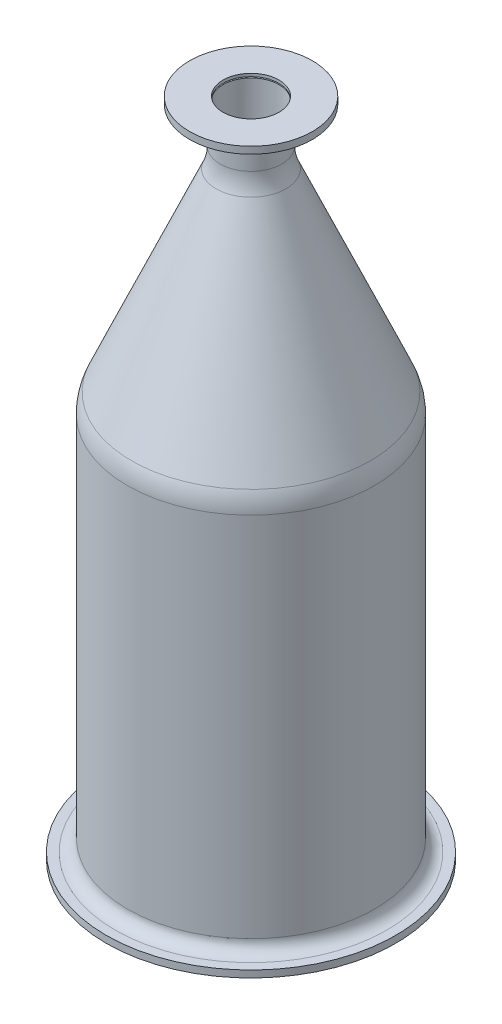
ISO-10303-21;
HEADER;
FILE_DESCRIPTION(('STEP AP214'),'2;1');
FILE_NAME('part.step','',(''),(''),'','','');
FILE_SCHEMA(('AUTOMOTIVE_DESIGN { 1 0 10303 214 1 1 1 1 }'));
ENDSEC;
DATA;
#1=APPLICATION_CONTEXT('core data for automotive mechanical design processes');
#2=APPLICATION_PROTOCOL_DEFINITION('international standard','automotive_design',2000,#1);
#3=PRODUCT_CONTEXT('',#1,'mechanical');
#4=PRODUCT('Part','Part','',(#3));
#5=PRODUCT_RELATED_PRODUCT_CATEGORY('part','',(#4));
#6=PRODUCT_DEFINITION_FORMATION('','',#4);
#7=PRODUCT_DEFINITION_CONTEXT('part definition',#1,'design');
#8=PRODUCT_DEFINITION('design','',#6,#7);
#9=PRODUCT_DEFINITION_SHAPE('','',#8);
#10=(LENGTH_UNIT() NAMED_UNIT(*) SI_UNIT(.MILLI.,.METRE.));
#11=(NAMED_UNIT(*) PLANE_ANGLE_UNIT() SI_UNIT($,.RADIAN.));
#12=(NAMED_UNIT(*) SI_UNIT($,.STERADIAN.) SOLID_ANGLE_UNIT());
#13=UNCERTAINTY_MEASURE_WITH_UNIT(LENGTH_MEASURE(1.E-05),#10,'distance_accuracy_value','');
#14=(GEOMETRIC_REPRESENTATION_CONTEXT(3) GLOBAL_UNCERTAINTY_ASSIGNED_CONTEXT((#13)) GLOBAL_UNIT_ASSIGNED_CONTEXT((#10,
#11,#12)) REPRESENTATION_CONTEXT('',''));
#15=CARTESIAN_POINT('',(0.,0.,0.));
#16=DIRECTION('',(0.,0.,1.));
#17=DIRECTION('',(1.,0.,0.));
#18=AXIS2_PLACEMENT_3D('',#15,#16,#17);
#19=CARTESIAN_POINT('',(0.,272.,0.));
#20=DIRECTION('',(0.,-1.,0.));
#21=DIRECTION('',(0.,0.,-1.));
#22=AXIS2_PLACEMENT_3D('',#19,#20,#21);
#23=CYLINDRICAL_SURFACE('',#22,12.7);
#24=CARTESIAN_POINT('',(0.,264.15,0.));
#25=DIRECTION('',(0.,1.,0.));
#26=DIRECTION('',(0.,0.,1.));
#27=AXIS2_PLACEMENT_3D('',#24,#25,#26);
#28=CIRCLE('',#27,12.7);
#29=CARTESIAN_POINT('',(0.,264.15,12.7));
#30=VERTEX_POINT('',#29);
#31=EDGE_CURVE('E11',#30,#30,#28,.F.);
#32=ORIENTED_EDGE('',*,*,#31,.T.);
#33=EDGE_LOOP('',(#32));
#34=FACE_BOUND('',#33,.T.);
#35=CARTESIAN_POINT('',(0.,254.180741628907,0.));
#36=DIRECTION('',(0.,1.,0.));
#37=DIRECTION('',(0.,0.,1.));
#38=AXIS2_PLACEMENT_3D('',#35,#36,#37);
#39=CIRCLE('',#38,12.7);
#40=CARTESIAN_POINT('',(0.,254.180741628907,12.7));
#41=VERTEX_POINT('',#40);
#42=EDGE_CURVE('E62',#41,#41,#39,.T.);
#43=ORIENTED_EDGE('',*,*,#42,.T.);
#44=EDGE_LOOP('',(#43));
#45=FACE_BOUND('',#44,.T.);
#46=ADVANCED_FACE('F33',(#34,#45),#23,.T.);
#47=CARTESIAN_POINT('',(0.,2.85,0.));
#48=DIRECTION('',(0.,-1.,0.));
#49=DIRECTION('',(0.,0.,-1.));
#50=AXIS2_PLACEMENT_3D('',#47,#48,#49);
#51=CYLINDRICAL_SURFACE('',#50,59.5);
#52=CARTESIAN_POINT('',(0.,2.85,0.));
#53=DIRECTION('',(0.,1.,0.));
#54=DIRECTION('',(0.,0.,1.));
#55=AXIS2_PLACEMENT_3D('',#52,#53,#54);
#56=CIRCLE('',#55,59.5);
#57=CARTESIAN_POINT('',(0.,2.85,59.5));
#58=VERTEX_POINT('',#57);
#59=EDGE_CURVE('E74',#58,#58,#56,.T.);
#60=ORIENTED_EDGE('',*,*,#59,.F.);
#61=EDGE_LOOP('',(#60));
#62=FACE_BOUND('',#61,.T.);
#63=CARTESIAN_POINT('',(0.,0.,0.));
#64=DIRECTION('',(0.,1.,0.));
#65=DIRECTION('',(0.,0.,1.));
#66=AXIS2_PLACEMENT_3D('',#63,#64,#65);
#67=CIRCLE('',#66,59.5);
#68=CARTESIAN_POINT('',(0.,0.,59.5));
#69=VERTEX_POINT('',#68);
#70=EDGE_CURVE('E80',#69,#69,#67,.T.);
#71=ORIENTED_EDGE('',*,*,#70,.T.);
#72=EDGE_LOOP('',(#71));
#73=FACE_BOUND('',#72,.T.);
#74=ADVANCED_FACE('F148',(#62,#73),#51,.T.);
#75=CARTESIAN_POINT('',(0.,2.85,0.));
#76=DIRECTION('',(0.,1.,0.));
#77=DIRECTION('',(0.,0.,1.));
#78=AXIS2_PLACEMENT_3D('',#75,#76,#77);
#79=PLANE('',#78);
#80=CARTESIAN_POINT('',(0.,2.85,0.));
#81=DIRECTION('',(0.,1.,0.));
#82=DIRECTION('',(0.,0.,1.));
#83=AXIS2_PLACEMENT_3D('',#80,#81,#82);
#84=CIRCLE('',#83,55.8);
#85=CARTESIAN_POINT('',(0.,2.85,55.8));
#86=VERTEX_POINT('',#85);
#87=EDGE_CURVE('E44',#86,#86,#84,.F.);
#88=ORIENTED_EDGE('',*,*,#87,.T.);
#89=EDGE_LOOP('',(#88));
#90=FACE_BOUND('',#89,.T.);
#91=ORIENTED_EDGE('',*,*,#59,.T.);
#92=EDGE_LOOP('',(#91));
#93=FACE_BOUND('',#92,.T.);
#94=ADVANCED_FACE('F153',(#90,#93),#79,.T.);
#95=CARTESIAN_POINT('',(0.,0.,0.));
#96=DIRECTION('',(0.,1.,0.));
#97=DIRECTION('',(0.,0.,1.));
#98=AXIS2_PLACEMENT_3D('',#95,#96,#97);
#99=PLANE('',#98);
#100=CARTESIAN_POINT('',(0.,0.,0.));
#101=DIRECTION('',(0.,-1.,0.));
#102=DIRECTION('',(0.,0.,-1.));
#103=AXIS2_PLACEMENT_3D('',#100,#101,#102);
#104=CIRCLE('',#103,48.8);
#105=CARTESIAN_POINT('',(0.,0.,-48.8));
#106=VERTEX_POINT('',#105);
#107=EDGE_CURVE('E89',#106,#106,#104,.T.);
#108=ORIENTED_EDGE('',*,*,#107,.F.);
#109=EDGE_LOOP('',(#108));
#110=FACE_BOUND('',#109,.T.);
#111=ORIENTED_EDGE('',*,*,#70,.F.);
#112=EDGE_LOOP('',(#111));
#113=FACE_BOUND('',#112,.T.);
#114=ADVANCED_FACE('F160',(#110,#113),#99,.F.);
#115=CARTESIAN_POINT('',(0.,162.85,0.));
#116=DIRECTION('',(0.,-1.,0.));
#117=DIRECTION('',(0.,0.,-1.));
#118=AXIS2_PLACEMENT_3D('',#115,#116,#117);
#119=CYLINDRICAL_SURFACE('',#118,50.8);
#120=CARTESIAN_POINT('',(0.,7.85,0.));
#121=DIRECTION('',(0.,1.,0.));
#122=DIRECTION('',(0.,0.,1.));
#123=AXIS2_PLACEMENT_3D('',#120,#121,#122);
#124=CIRCLE('',#123,50.8);
#125=CARTESIAN_POINT('',(0.,7.85,50.8));
#126=VERTEX_POINT('',#125);
#127=EDGE_CURVE('E48',#126,#126,#124,.T.);
#128=ORIENTED_EDGE('',*,*,#127,.T.);
#129=EDGE_LOOP('',(#128));
#130=FACE_BOUND('',#129,.T.);
#131=CARTESIAN_POINT('',(0.,158.669258371093,0.));
#132=DIRECTION('',(0.,-1.,0.));
#133=DIRECTION('',(0.,0.,-1.));
#134=AXIS2_PLACEMENT_3D('',#131,#132,#133);
#135=CIRCLE('',#134,50.8);
#136=CARTESIAN_POINT('',(0.,158.669258371093,-50.8));
#137=VERTEX_POINT('',#136);
#138=EDGE_CURVE('E53',#137,#137,#135,.T.);
#139=ORIENTED_EDGE('',*,*,#138,.T.);
#140=EDGE_LOOP('',(#139));
#141=FACE_BOUND('',#140,.T.);
#142=ADVANCED_FACE('F144',(#130,#141),#119,.T.);
#143=CARTESIAN_POINT('',(0.,250.,0.));
#144=DIRECTION('',(0.,-1.,0.));
#145=DIRECTION('',(0.,0.,-1.));
#146=AXIS2_PLACEMENT_3D('',#143,#144,#145);
#147=CONICAL_SURFACE('',#146,12.7,0.412139536781909);
#148=CARTESIAN_POINT('',(0.,246.169329071286,0.));
#149=DIRECTION('',(0.,1.,0.));
#150=DIRECTION('',(0.,0.,1.));
#151=AXIS2_PLACEMENT_3D('',#148,#149,#150);
#152=CIRCLE('',#151,14.3746822992999);
#153=CARTESIAN_POINT('',(0.,246.169329071286,-14.3746822992999));
#154=VERTEX_POINT('',#153);
#155=EDGE_CURVE('E56',#154,#154,#152,.F.);
#156=CARTESIAN_POINT('',(0.,166.680670928714,0.));
#157=DIRECTION('',(0.,-1.,0.));
#158=DIRECTION('',(0.,0.,-1.));
#159=AXIS2_PLACEMENT_3D('',#156,#157,#158);
#160=CIRCLE('',#159,49.1253177007001);
#161=CARTESIAN_POINT('',(0.,166.680670928714,-49.1253177007001));
#162=VERTEX_POINT('',#161);
#163=EDGE_CURVE('E59',#162,#162,#160,.F.);
#164=CARTESIAN_POINT('',(0.,246.169329071286,-14.3746822992999));
#165=CARTESIAN_POINT('',(0.,245.341322215635,-14.7366680847312));
#166=CARTESIAN_POINT('',(0.,244.513315359983,-15.0986538701624));
#167=CARTESIAN_POINT('',(0.,242.857301648679,-15.8226254410249));
#168=CARTESIAN_POINT('',(0.,242.029294793027,-16.1846112264562));
#169=CARTESIAN_POINT('',(0.,240.373281081724,-16.9085827973187));
#170=CARTESIAN_POINT('',(0.,239.545274226072,-17.2705685827499));
#171=CARTESIAN_POINT('',(0.,237.889260514768,-17.9945401536124));
#172=CARTESIAN_POINT('',(0.,237.061253659117,-18.3565259390437));
#173=CARTESIAN_POINT('',(0.,235.405239947813,-19.0804975099062));
#174=CARTESIAN_POINT('',(0.,234.577233092161,-19.4424832953374));
#175=CARTESIAN_POINT('',(0.,232.921219380858,-20.1664548661999));
#176=CARTESIAN_POINT('',(0.,232.093212525206,-20.5284406516312));
#177=CARTESIAN_POINT('',(0.,230.437198813902,-21.2524122224937));
#178=CARTESIAN_POINT('',(0.,229.60919195825,-21.6143980079249));
#179=CARTESIAN_POINT('',(0.,227.953178246947,-22.3383695787875));
#180=CARTESIAN_POINT('',(0.,227.125171391295,-22.7003553642187));
#181=CARTESIAN_POINT('',(0.,225.469157679991,-23.4243269350812));
#182=CARTESIAN_POINT('',(0.,224.64115082434,-23.7863127205125));
#183=CARTESIAN_POINT('',(0.,222.985137113036,-24.510284291375));
#184=CARTESIAN_POINT('',(0.,222.157130257384,-24.8722700768062));
#185=CARTESIAN_POINT('',(0.,220.501116546081,-25.5962416476687));
#186=CARTESIAN_POINT('',(0.,219.673109690429,-25.9582274331));
#187=CARTESIAN_POINT('',(0.,218.017095979125,-26.6821990039625));
#188=CARTESIAN_POINT('',(0.,217.189089123473,-27.0441847893937));
#189=CARTESIAN_POINT('',(0.,215.53307541217,-27.7681563602562));
#190=CARTESIAN_POINT('',(0.,214.705068556518,-28.1301421456875));
#191=CARTESIAN_POINT('',(0.,213.049054845214,-28.85411371655));
#192=CARTESIAN_POINT('',(0.,212.221047989563,-29.2160995019812));
#193=CARTESIAN_POINT('',(0.,210.565034278259,-29.9400710728437));
#194=CARTESIAN_POINT('',(0.,209.737027422607,-30.302056858275));
#195=CARTESIAN_POINT('',(0.,208.081013711304,-31.0260284291375));
#196=CARTESIAN_POINT('',(0.,207.253006855652,-31.3880142145688));
#197=CARTESIAN_POINT('',(0.,205.596993144348,-32.1119857854313));
#198=CARTESIAN_POINT('',(0.,204.768986288696,-32.4739715708625));
#199=CARTESIAN_POINT('',(0.,203.112972577393,-33.197943141725));
#200=CARTESIAN_POINT('',(0.,202.284965721741,-33.5599289271563));
#201=CARTESIAN_POINT('',(0.,200.628952010437,-34.2839004980188));
#202=CARTESIAN_POINT('',(0.,199.800945154786,-34.64588628345));
#203=CARTESIAN_POINT('',(0.,198.144931443482,-35.3698578543125));
#204=CARTESIAN_POINT('',(0.,197.31692458783,-35.7318436397438));
#205=CARTESIAN_POINT('',(0.,195.660910876527,-36.4558152106063));
#206=CARTESIAN_POINT('',(0.,194.832904020875,-36.8178009960375));
#207=CARTESIAN_POINT('',(0.,193.176890309571,-37.5417725669));
#208=CARTESIAN_POINT('',(0.,192.348883453919,-37.9037583523313));
#209=CARTESIAN_POINT('',(0.,190.692869742616,-38.6277299231938));
#210=CARTESIAN_POINT('',(0.,189.864862886964,-38.989715708625));
#211=CARTESIAN_POINT('',(0.,188.20884917566,-39.7136872794875));
#212=CARTESIAN_POINT('',(0.,187.380842320009,-40.0756730649188));
#213=CARTESIAN_POINT('',(0.,185.724828608705,-40.7996446357813));
#214=CARTESIAN_POINT('',(0.,184.896821753053,-41.1616304212125));
#215=CARTESIAN_POINT('',(0.,183.24080804175,-41.885601992075));
#216=CARTESIAN_POINT('',(0.,182.412801186098,-42.2475877775063));
#217=CARTESIAN_POINT('',(0.,180.756787474794,-42.9715593483688));
#218=CARTESIAN_POINT('',(0.,179.928780619142,-43.3335451338001));
#219=CARTESIAN_POINT('',(0.,178.272766907839,-44.0575167046626));
#220=CARTESIAN_POINT('',(0.,177.444760052187,-44.4195024900938));
#221=CARTESIAN_POINT('',(0.,175.788746340883,-45.1434740609563));
#222=CARTESIAN_POINT('',(0.,174.960739485232,-45.5054598463876));
#223=CARTESIAN_POINT('',(0.,173.304725773928,-46.2294314172501));
#224=CARTESIAN_POINT('',(0.,172.476718918276,-46.5914172026813));
#225=CARTESIAN_POINT('',(0.,170.820705206973,-47.3153887735438));
#226=CARTESIAN_POINT('',(0.,169.992698351321,-47.6773745589751));
#227=CARTESIAN_POINT('',(0.,168.336684640017,-48.4013461298376));
#228=CARTESIAN_POINT('',(0.,167.508677784365,-48.7633319152689));
#229=CARTESIAN_POINT('',(0.,166.680670928714,-49.1253177007001));
#230=B_SPLINE_CURVE_WITH_KNOTS('',3,(#164,#165,#166,#167,#168,#169,#170,#171,#172,#173,#174,
#175,#176,#177,#178,#179,#180,#181,#182,#183,#184,#185,#186,#187,#188,#189,#190,#191,#192,#193,
#194,#195,#196,#197,#198,#199,#200,#201,#202,#203,#204,#205,#206,#207,#208,#209,#210,#211,#212,
#213,#214,#215,#216,#217,#218,#219,#220,#221,#222,#223,#224,#225,#226,#227,#228,#229),
.UNSPECIFIED.,.F.,.F.,(4,2,2,2,2,2,2,2,2,2,2,2,2,2,2,2,2,2,2,2,2,2,2,2,2,2,2,2,2,2,2,2,4),(0.,
2.71102592328918,5.42205184657837,8.13307776986752,10.8441036931567,13.5551296164459,
16.2661555397351,18.9771814630243,21.6882073863134,24.3992333096026,27.1102592328918,
29.821285156181,32.5323110794702,35.2433370027593,37.9543629260485,40.6653888493377,
43.3764147726269,46.0874406959161,48.7984666192052,51.5094925424944,54.2205184657836,
56.9315443890728,59.642570312362,62.3535962356511,65.0646221589403,67.7756480822295,
70.4866740055187,73.1976999288079,75.9087258520971,78.6197517753863,81.3307776986754,
84.0418036219646,86.7528295452538),.UNSPECIFIED.);
#231=EDGE_CURVE('BSEAM136',#154,#162,#230,.T.);
#232=ORIENTED_EDGE('',*,*,#155,.T.);
#233=ORIENTED_EDGE('',*,*,#163,.T.);
#234=ORIENTED_EDGE('',*,*,#231,.T.);
#235=ORIENTED_EDGE('',*,*,#231,.F.);
#236=EDGE_LOOP('',(#232,#234,#233,#235));
#237=FACE_BOUND('',#236,.T.);
#238=ADVANCED_FACE('F136',(#237),#147,.T.);
#239=CARTESIAN_POINT('',(0.,269.15,0.));
#240=DIRECTION('',(0.,1.,0.));
#241=DIRECTION('',(0.,0.,1.));
#242=AXIS2_PLACEMENT_3D('',#239,#240,#241);
#243=CYLINDRICAL_SURFACE('',#242,25.25);
#244=CARTESIAN_POINT('',(0.,269.15,0.));
#245=DIRECTION('',(0.,1.,0.));
#246=DIRECTION('',(0.,0.,1.));
#247=AXIS2_PLACEMENT_3D('',#244,#245,#246);
#248=CIRCLE('',#247,25.25);
#249=CARTESIAN_POINT('',(0.,269.15,25.25));
#250=VERTEX_POINT('',#249);
#251=EDGE_CURVE('E83',#250,#250,#248,.T.);
#252=ORIENTED_EDGE('',*,*,#251,.T.);
#253=EDGE_LOOP('',(#252));
#254=FACE_BOUND('',#253,.T.);
#255=CARTESIAN_POINT('',(0.,272.,0.));
#256=DIRECTION('',(0.,1.,0.));
#257=DIRECTION('',(0.,0.,1.));
#258=AXIS2_PLACEMENT_3D('',#255,#256,#257);
#259=CIRCLE('',#258,25.25);
#260=CARTESIAN_POINT('',(0.,272.,25.25));
#261=VERTEX_POINT('',#260);
#262=EDGE_CURVE('E86',#261,#261,#259,.T.);
#263=ORIENTED_EDGE('',*,*,#262,.F.);
#264=EDGE_LOOP('',(#263));
#265=FACE_BOUND('',#264,.T.);
#266=ADVANCED_FACE('F134',(#254,#265),#243,.T.);
#267=CARTESIAN_POINT('',(0.,269.15,0.));
#268=DIRECTION('',(0.,1.,0.));
#269=DIRECTION('',(0.,0.,1.));
#270=AXIS2_PLACEMENT_3D('',#267,#268,#269);
#271=PLANE('',#270);
#272=CARTESIAN_POINT('',(0.,269.15,0.));
#273=DIRECTION('',(0.,1.,0.));
#274=DIRECTION('',(0.,0.,1.));
#275=AXIS2_PLACEMENT_3D('',#272,#273,#274);
#276=CIRCLE('',#275,17.7);
#277=CARTESIAN_POINT('',(0.,269.15,17.7));
#278=VERTEX_POINT('',#277);
#279=EDGE_CURVE('E40',#278,#278,#276,.T.);
#280=ORIENTED_EDGE('',*,*,#279,.T.);
#281=EDGE_LOOP('',(#280));
#282=FACE_BOUND('',#281,.T.);
#283=ORIENTED_EDGE('',*,*,#251,.F.);
#284=EDGE_LOOP('',(#283));
#285=FACE_BOUND('',#284,.T.);
#286=ADVANCED_FACE('F130',(#282,#285),#271,.F.);
#287=CARTESIAN_POINT('',(0.,272.,0.));
#288=DIRECTION('',(0.,1.,0.));
#289=DIRECTION('',(0.,0.,1.));
#290=AXIS2_PLACEMENT_3D('',#287,#288,#289);
#291=PLANE('',#290);
#292=CARTESIAN_POINT('',(0.,272.,0.));
#293=DIRECTION('',(0.,1.,0.));
#294=DIRECTION('',(0.,0.,1.));
#295=AXIS2_PLACEMENT_3D('',#292,#293,#294);
#296=CIRCLE('',#295,11.5);
#297=CARTESIAN_POINT('',(0.,272.,11.5));
#298=VERTEX_POINT('',#297);
#299=EDGE_CURVE('E79',#298,#298,#296,.T.);
#300=ORIENTED_EDGE('',*,*,#299,.F.);
#301=EDGE_LOOP('',(#300));
#302=FACE_BOUND('',#301,.T.);
#303=ORIENTED_EDGE('',*,*,#262,.T.);
#304=EDGE_LOOP('',(#303));
#305=FACE_BOUND('',#304,.T.);
#306=ADVANCED_FACE('F126',(#302,#305),#291,.T.);
#307=CARTESIAN_POINT('',(0.,162.85,0.));
#308=DIRECTION('',(0.,-1.,0.));
#309=DIRECTION('',(0.,0.,-1.));
#310=AXIS2_PLACEMENT_3D('',#307,#308,#309);
#311=CYLINDRICAL_SURFACE('',#310,48.8);
#312=CARTESIAN_POINT('',(0.,156.026511156307,0.));
#313=DIRECTION('',(0.,1.,0.));
#314=DIRECTION('',(0.,0.,1.));
#315=AXIS2_PLACEMENT_3D('',#312,#313,#314);
#316=CIRCLE('',#315,48.8);
#317=CARTESIAN_POINT('',(0.,156.026511156307,48.8));
#318=VERTEX_POINT('',#317);
#319=EDGE_CURVE('E71',#318,#318,#316,.T.);
#320=ORIENTED_EDGE('',*,*,#319,.T.);
#321=EDGE_LOOP('',(#320));
#322=FACE_BOUND('',#321,.T.);
#323=ORIENTED_EDGE('',*,*,#107,.T.);
#324=EDGE_LOOP('',(#323));
#325=FACE_BOUND('',#324,.T.);
#326=ADVANCED_FACE('F129',(#322,#325),#311,.F.);
#327=CARTESIAN_POINT('',(0.,272.,0.));
#328=DIRECTION('',(0.,-1.,0.));
#329=DIRECTION('',(0.,0.,-1.));
#330=AXIS2_PLACEMENT_3D('',#327,#328,#329);
#331=CYLINDRICAL_SURFACE('',#330,11.5);
#332=CARTESIAN_POINT('',(0.,253.929897131173,0.));
#333=DIRECTION('',(0.,-1.,0.));
#334=DIRECTION('',(0.,0.,-1.));
#335=AXIS2_PLACEMENT_3D('',#332,#333,#334);
#336=CIRCLE('',#335,11.5);
#337=CARTESIAN_POINT('',(0.,253.929897131173,-11.5));
#338=VERTEX_POINT('',#337);
#339=EDGE_CURVE('E65',#338,#338,#336,.T.);
#340=ORIENTED_EDGE('',*,*,#339,.T.);
#341=EDGE_LOOP('',(#340));
#342=FACE_BOUND('',#341,.T.);
#343=CARTESIAN_POINT('',(0.,270.35,0.));
#344=DIRECTION('',(0.,1.,0.));
#345=DIRECTION('',(0.,0.,1.));
#346=AXIS2_PLACEMENT_3D('',#343,#344,#345);
#347=CIRCLE('',#346,11.5);
#348=CARTESIAN_POINT('',(0.,270.35,11.5));
#349=VERTEX_POINT('',#348);
#350=EDGE_CURVE('E94',#349,#349,#347,.T.);
#351=ORIENTED_EDGE('',*,*,#350,.T.);
#352=EDGE_LOOP('',(#351));
#353=FACE_BOUND('',#352,.T.);
#354=ADVANCED_FACE('F285',(#342,#353),#331,.F.);
#355=CARTESIAN_POINT('',(0.,2.85,0.));
#356=DIRECTION('',(0.,-1.,0.));
#357=DIRECTION('',(0.,0.,-1.));
#358=AXIS2_PLACEMENT_3D('',#355,#356,#357);
#359=CYLINDRICAL_SURFACE('',#358,58.3);
#360=CARTESIAN_POINT('',(0.,1.65,0.));
#361=DIRECTION('',(0.,1.,0.));
#362=DIRECTION('',(0.,0.,1.));
#363=AXIS2_PLACEMENT_3D('',#360,#361,#362);
#364=CIRCLE('',#363,58.3);
#365=CARTESIAN_POINT('',(0.,1.65,58.3));
#366=VERTEX_POINT('',#365);
#367=EDGE_CURVE('E110',#366,#366,#364,.T.);
#368=ORIENTED_EDGE('',*,*,#367,.T.);
#369=EDGE_LOOP('',(#368));
#370=FACE_BOUND('',#369,.T.);
#371=CARTESIAN_POINT('',(0.,1.2,0.));
#372=DIRECTION('',(0.,1.,0.));
#373=DIRECTION('',(0.,0.,1.));
#374=AXIS2_PLACEMENT_3D('',#371,#372,#373);
#375=CIRCLE('',#374,58.3);
#376=CARTESIAN_POINT('',(0.,1.2,58.3));
#377=VERTEX_POINT('',#376);
#378=EDGE_CURVE('E107',#377,#377,#375,.T.);
#379=ORIENTED_EDGE('',*,*,#378,.F.);
#380=EDGE_LOOP('',(#379));
#381=FACE_BOUND('',#380,.T.);
#382=ADVANCED_FACE('F290',(#370,#381),#359,.F.);
#383=CARTESIAN_POINT('',(0.,1.65,0.));
#384=DIRECTION('',(0.,1.,0.));
#385=DIRECTION('',(0.,0.,1.));
#386=AXIS2_PLACEMENT_3D('',#383,#384,#385);
#387=PLANE('',#386);
#388=CARTESIAN_POINT('',(0.,1.65000000000001,0.));
#389=DIRECTION('',(0.,1.,0.));
#390=DIRECTION('',(0.,0.,1.));
#391=AXIS2_PLACEMENT_3D('',#388,#389,#390);
#392=CIRCLE('',#391,49.6);
#393=CARTESIAN_POINT('',(0.,1.65000000000001,49.6));
#394=VERTEX_POINT('',#393);
#395=EDGE_CURVE('E113',#394,#394,#392,.T.);
#396=ORIENTED_EDGE('',*,*,#395,.T.);
#397=EDGE_LOOP('',(#396));
#398=FACE_BOUND('',#397,.T.);
#399=ORIENTED_EDGE('',*,*,#367,.F.);
#400=EDGE_LOOP('',(#399));
#401=FACE_BOUND('',#400,.T.);
#402=ADVANCED_FACE('F373',(#398,#401),#387,.F.);
#403=CARTESIAN_POINT('',(0.,1.2,0.));
#404=DIRECTION('',(0.,1.,0.));
#405=DIRECTION('',(0.,0.,1.));
#406=AXIS2_PLACEMENT_3D('',#403,#404,#405);
#407=PLANE('',#406);
#408=CARTESIAN_POINT('',(0.,1.20000000000001,0.));
#409=DIRECTION('',(0.,1.,0.));
#410=DIRECTION('',(0.,0.,1.));
#411=AXIS2_PLACEMENT_3D('',#408,#409,#410);
#412=CIRCLE('',#411,50.);
#413=CARTESIAN_POINT('',(0.,1.20000000000001,50.));
#414=VERTEX_POINT('',#413);
#415=EDGE_CURVE('E78',#414,#414,#412,.F.);
#416=ORIENTED_EDGE('',*,*,#415,.T.);
#417=EDGE_LOOP('',(#416));
#418=FACE_BOUND('',#417,.T.);
#419=ORIENTED_EDGE('',*,*,#378,.T.);
#420=EDGE_LOOP('',(#419));
#421=FACE_BOUND('',#420,.T.);
#422=ADVANCED_FACE('F363',(#418,#421),#407,.T.);
#423=CARTESIAN_POINT('',(0.,162.85,0.));
#424=DIRECTION('',(0.,-1.,0.));
#425=DIRECTION('',(0.,0.,-1.));
#426=AXIS2_PLACEMENT_3D('',#423,#424,#425);
#427=CYLINDRICAL_SURFACE('',#426,49.6);
#428=CARTESIAN_POINT('',(0.,162.599155502266,0.));
#429=DIRECTION('',(0.,-1.,0.));
#430=DIRECTION('',(0.,0.,-1.));
#431=AXIS2_PLACEMENT_3D('',#428,#429,#430);
#432=CIRCLE('',#431,49.6);
#433=CARTESIAN_POINT('',(0.,162.599155502266,-49.6));
#434=VERTEX_POINT('',#433);
#435=EDGE_CURVE('E104',#434,#434,#432,.F.);
#436=ORIENTED_EDGE('',*,*,#435,.T.);
#437=EDGE_LOOP('',(#436));
#438=FACE_BOUND('',#437,.T.);
#439=ORIENTED_EDGE('',*,*,#395,.F.);
#440=EDGE_LOOP('',(#439));
#441=FACE_BOUND('',#440,.T.);
#442=ADVANCED_FACE('F275',(#438,#441),#427,.F.);
#443=CARTESIAN_POINT('',(0.,249.519315246543,0.));
#444=DIRECTION('',(0.,-1.,0.));
#445=DIRECTION('',(0.,0.,-1.));
#446=AXIS2_PLACEMENT_3D('',#443,#444,#445);
#447=CONICAL_SURFACE('',#446,11.600480937958,0.412139536781909);
#448=CARTESIAN_POINT('',(0.,245.918484573552,0.));
#449=DIRECTION('',(0.,-1.,0.));
#450=DIRECTION('',(0.,0.,-1.));
#451=AXIS2_PLACEMENT_3D('',#448,#449,#450);
#452=CIRCLE('',#451,13.1746822992999);
#453=CARTESIAN_POINT('',(0.,245.918484573552,-13.1746822992999));
#454=VERTEX_POINT('',#453);
#455=EDGE_CURVE('E68',#454,#454,#452,.F.);
#456=CARTESIAN_POINT('',(0.,245.918484573552,-13.1746822992999));
#457=CARTESIAN_POINT('',(0.,245.050574895726,-13.5541126920155));
#458=CARTESIAN_POINT('',(0.,244.1826652179,-13.9335430847311));
#459=CARTESIAN_POINT('',(0.,242.446845862248,-14.6924038701624));
#460=CARTESIAN_POINT('',(0.,241.578936184423,-15.071834262878));
#461=CARTESIAN_POINT('',(0.,239.843116828771,-15.8306950483093));
#462=CARTESIAN_POINT('',(0.,238.975207150945,-16.2101254410249));
#463=CARTESIAN_POINT('',(0.,237.239387795293,-16.9689862264562));
#464=CARTESIAN_POINT('',(0.,236.371478117467,-17.3484166191718));
#465=CARTESIAN_POINT('',(0.,234.635658761815,-18.107277404603));
#466=CARTESIAN_POINT('',(0.,233.767749083989,-18.4867077973187));
#467=CARTESIAN_POINT('',(0.,232.031929728338,-19.2455685827499));
#468=CARTESIAN_POINT('',(0.,231.164020050512,-19.6249989754655));
#469=CARTESIAN_POINT('',(0.,229.42820069486,-20.3838597608968));
#470=CARTESIAN_POINT('',(0.,228.560291017034,-20.7632901536124));
#471=CARTESIAN_POINT('',(0.,226.824471661382,-21.5221509390437));
#472=CARTESIAN_POINT('',(0.,225.956561983556,-21.9015813317593));
#473=CARTESIAN_POINT('',(0.,224.220742627905,-22.6604421171905));
#474=CARTESIAN_POINT('',(0.,223.352832950079,-23.0398725099062));
#475=CARTESIAN_POINT('',(0.,221.617013594427,-23.7987332953374));
#476=CARTESIAN_POINT('',(0.,220.749103916601,-24.178163688053));
#477=CARTESIAN_POINT('',(0.,219.013284560949,-24.9370244734843));
#478=CARTESIAN_POINT('',(0.,218.145374883123,-25.3164548661999));
#479=CARTESIAN_POINT('',(0.,216.409555527471,-26.0753156516312));
#480=CARTESIAN_POINT('',(0.,215.541645849646,-26.4547460443468));
#481=CARTESIAN_POINT('',(0.,213.805826493994,-27.2136068297781));
#482=CARTESIAN_POINT('',(0.,212.937916816168,-27.5930372224937));
#483=CARTESIAN_POINT('',(0.,211.202097460516,-28.3518980079249));
#484=CARTESIAN_POINT('',(0.,210.33418778269,-28.7313284006406));
#485=CARTESIAN_POINT('',(0.,208.598368427038,-29.4901891860718));
#486=CARTESIAN_POINT('',(0.,207.730458749212,-29.8696195787874));
#487=CARTESIAN_POINT('',(0.,205.994639393561,-30.6284803642187));
#488=CARTESIAN_POINT('',(0.,205.126729715735,-31.0079107569343));
#489=CARTESIAN_POINT('',(0.,203.390910360083,-31.7667715423656));
#490=CARTESIAN_POINT('',(0.,202.523000682257,-32.1462019350812));
#491=CARTESIAN_POINT('',(0.,200.787181326605,-32.9050627205124));
#492=CARTESIAN_POINT('',(0.,199.919271648779,-33.2844931132281));
#493=CARTESIAN_POINT('',(0.,198.183452293128,-34.0433538986593));
#494=CARTESIAN_POINT('',(0.,197.315542615302,-34.422784291375));
#495=CARTESIAN_POINT('',(0.,195.57972325965,-35.1816450768062));
#496=CARTESIAN_POINT('',(0.,194.711813581824,-35.5610754695218));
#497=CARTESIAN_POINT('',(0.,192.975994226172,-36.3199362549531));
#498=CARTESIAN_POINT('',(0.,192.108084548346,-36.6993666476687));
#499=CARTESIAN_POINT('',(0.,190.372265192694,-37.4582274331));
#500=CARTESIAN_POINT('',(0.,189.504355514869,-37.8376578258156));
#501=CARTESIAN_POINT('',(0.,187.768536159217,-38.5965186112468));
#502=CARTESIAN_POINT('',(0.,186.900626481391,-38.9759490039624));
#503=CARTESIAN_POINT('',(0.,185.164807125739,-39.7348097893937));
#504=CARTESIAN_POINT('',(0.,184.296897447913,-40.1142401821093));
#505=CARTESIAN_POINT('',(0.,182.561078092261,-40.8731009675406));
#506=CARTESIAN_POINT('',(0.,181.693168414435,-41.2525313602562));
#507=CARTESIAN_POINT('',(0.,179.957349058784,-42.0113921456875));
#508=CARTESIAN_POINT('',(0.,179.089439380958,-42.3908225384031));
#509=CARTESIAN_POINT('',(0.,177.353620025306,-43.1496833238343));
#510=CARTESIAN_POINT('',(0.,176.48571034748,-43.52911371655));
#511=CARTESIAN_POINT('',(0.,174.749890991828,-44.2879745019812));
#512=CARTESIAN_POINT('',(0.,173.881981314002,-44.6674048946968));
#513=CARTESIAN_POINT('',(0.,172.14616195835,-45.4262656801281));
#514=CARTESIAN_POINT('',(0.,171.278252280525,-45.8056960728437));
#515=CARTESIAN_POINT('',(0.,169.542432924873,-46.564556858275));
#516=CARTESIAN_POINT('',(0.,168.674523247047,-46.9439872509906));
#517=CARTESIAN_POINT('',(0.,166.938703891395,-47.7028480364218));
#518=CARTESIAN_POINT('',(0.,166.070794213569,-48.0822784291375));
#519=CARTESIAN_POINT('',(0.,164.334974857917,-48.8411392145687));
#520=CARTESIAN_POINT('',(0.,163.467065180091,-49.2205696072843));
#521=CARTESIAN_POINT('',(0.,162.599155502266,-49.6));
#522=B_SPLINE_CURVE_WITH_KNOTS('',3,(#456,#457,#458,#459,#460,#461,#462,#463,#464,#465,#466,
#467,#468,#469,#470,#471,#472,#473,#474,#475,#476,#477,#478,#479,#480,#481,#482,#483,#484,#485,
#486,#487,#488,#489,#490,#491,#492,#493,#494,#495,#496,#497,#498,#499,#500,#501,#502,#503,#504,
#505,#506,#507,#508,#509,#510,#511,#512,#513,#514,#515,#516,#517,#518,#519,#520,#521),
.UNSPECIFIED.,.F.,.F.,(4,2,2,2,2,2,2,2,2,2,2,2,2,2,2,2,2,2,2,2,2,2,2,2,2,2,2,2,2,2,2,2,4),(0.,
2.84167409919256,5.68334819838509,8.52502229757762,11.3666963967702,14.2083704959627,
17.0500445951552,19.8917186943478,22.7333927935403,25.5750668927329,28.4167409919254,
31.2584150911179,34.1000891903105,36.941763289503,39.7834373886956,42.6251114878881,
45.4667855870807,48.3084596862732,51.1501337854657,53.9918078846583,56.8334819838508,
59.6751560830433,62.5168301822359,65.3585042814284,68.200178380621,71.0418524798135,
73.883526579006,76.7252006781986,79.5668747773911,82.4085488765837,85.2502229757762,
88.0918970749688,90.9335711741613),.UNSPECIFIED.);
#523=EDGE_CURVE('BSEAM269',#454,#434,#522,.T.);
#524=ORIENTED_EDGE('',*,*,#455,.T.);
#525=ORIENTED_EDGE('',*,*,#435,.F.);
#526=ORIENTED_EDGE('',*,*,#523,.T.);
#527=ORIENTED_EDGE('',*,*,#523,.F.);
#528=EDGE_LOOP('',(#524,#526,#525,#527));
#529=FACE_BOUND('',#528,.T.);
#530=ADVANCED_FACE('F269',(#529),#447,.F.);
#531=CARTESIAN_POINT('',(0.,269.15,0.));
#532=DIRECTION('',(0.,1.,0.));
#533=DIRECTION('',(0.,0.,1.));
#534=AXIS2_PLACEMENT_3D('',#531,#532,#533);
#535=CYLINDRICAL_SURFACE('',#534,24.05);
#536=CARTESIAN_POINT('',(0.,270.35,0.));
#537=DIRECTION('',(0.,1.,0.));
#538=DIRECTION('',(0.,0.,1.));
#539=AXIS2_PLACEMENT_3D('',#536,#537,#538);
#540=CIRCLE('',#539,24.05);
#541=CARTESIAN_POINT('',(0.,270.35,24.05));
#542=VERTEX_POINT('',#541);
#543=EDGE_CURVE('E101',#542,#542,#540,.T.);
#544=ORIENTED_EDGE('',*,*,#543,.F.);
#545=EDGE_LOOP('',(#544));
#546=FACE_BOUND('',#545,.T.);
#547=CARTESIAN_POINT('',(0.,270.8,0.));
#548=DIRECTION('',(0.,1.,0.));
#549=DIRECTION('',(0.,0.,1.));
#550=AXIS2_PLACEMENT_3D('',#547,#548,#549);
#551=CIRCLE('',#550,24.05);
#552=CARTESIAN_POINT('',(0.,270.8,24.05));
#553=VERTEX_POINT('',#552);
#554=EDGE_CURVE('E98',#553,#553,#551,.T.);
#555=ORIENTED_EDGE('',*,*,#554,.T.);
#556=EDGE_LOOP('',(#555));
#557=FACE_BOUND('',#556,.T.);
#558=ADVANCED_FACE('F274',(#546,#557),#535,.F.);
#559=CARTESIAN_POINT('',(0.,270.35,0.));
#560=DIRECTION('',(0.,1.,0.));
#561=DIRECTION('',(0.,0.,1.));
#562=AXIS2_PLACEMENT_3D('',#559,#560,#561);
#563=PLANE('',#562);
#564=ORIENTED_EDGE('',*,*,#350,.F.);
#565=EDGE_LOOP('',(#564));
#566=FACE_BOUND('',#565,.T.);
#567=ORIENTED_EDGE('',*,*,#543,.T.);
#568=EDGE_LOOP('',(#567));
#569=FACE_BOUND('',#568,.T.);
#570=ADVANCED_FACE('F326',(#566,#569),#563,.T.);
#571=CARTESIAN_POINT('',(0.,270.8,0.));
#572=DIRECTION('',(0.,1.,0.));
#573=DIRECTION('',(0.,0.,1.));
#574=AXIS2_PLACEMENT_3D('',#571,#572,#573);
#575=PLANE('',#574);
#576=CARTESIAN_POINT('',(0.,270.8,0.));
#577=DIRECTION('',(0.,1.,0.));
#578=DIRECTION('',(0.,0.,1.));
#579=AXIS2_PLACEMENT_3D('',#576,#577,#578);
#580=CIRCLE('',#579,11.5);
#581=CARTESIAN_POINT('',(0.,270.8,11.5));
#582=VERTEX_POINT('',#581);
#583=EDGE_CURVE('E75',#582,#582,#580,.T.);
#584=ORIENTED_EDGE('',*,*,#583,.T.);
#585=EDGE_LOOP('',(#584));
#586=FACE_BOUND('',#585,.T.);
#587=ORIENTED_EDGE('',*,*,#554,.F.);
#588=EDGE_LOOP('',(#587));
#589=FACE_BOUND('',#588,.T.);
#590=ADVANCED_FACE('F321',(#586,#589),#575,.F.);
#591=CARTESIAN_POINT('',(0.,162.85,0.));
#592=DIRECTION('',(0.,-1.,0.));
#593=DIRECTION('',(0.,0.,-1.));
#594=AXIS2_PLACEMENT_3D('',#591,#592,#593);
#595=CYLINDRICAL_SURFACE('',#594,50.);
#596=CARTESIAN_POINT('',(0.,162.85,0.));
#597=DIRECTION('',(0.,-1.,0.));
#598=DIRECTION('',(0.,0.,-1.));
#599=AXIS2_PLACEMENT_3D('',#596,#597,#598);
#600=CIRCLE('',#599,50.);
#601=CARTESIAN_POINT('',(0.,162.85,-50.));
#602=VERTEX_POINT('',#601);
#603=EDGE_CURVE('E95',#602,#602,#600,.T.);
#604=ORIENTED_EDGE('',*,*,#603,.T.);
#605=EDGE_LOOP('',(#604));
#606=FACE_BOUND('',#605,.T.);
#607=ORIENTED_EDGE('',*,*,#415,.F.);
#608=EDGE_LOOP('',(#607));
#609=FACE_BOUND('',#608,.T.);
#610=ADVANCED_FACE('F314',(#606,#609),#595,.T.);
#611=CARTESIAN_POINT('',(0.,250.,0.));
#612=DIRECTION('',(0.,1.,0.));
#613=DIRECTION('',(0.,0.,1.));
#614=AXIS2_PLACEMENT_3D('',#611,#612,#613);
#615=CYLINDRICAL_SURFACE('',#614,11.5);
#616=ORIENTED_EDGE('',*,*,#299,.T.);
#617=EDGE_LOOP('',(#616));
#618=FACE_BOUND('',#617,.T.);
#619=ORIENTED_EDGE('',*,*,#583,.F.);
#620=EDGE_LOOP('',(#619));
#621=FACE_BOUND('',#620,.T.);
#622=ADVANCED_FACE('F123',(#618,#621),#615,.F.);
#623=CARTESIAN_POINT('',(0.,156.026511156307,0.));
#624=DIRECTION('',(0.,1.,0.));
#625=DIRECTION('',(0.,0.,1.));
#626=AXIS2_PLACEMENT_3D('',#623,#624,#625);
#627=TOROIDAL_SURFACE('',#626,68.8,20.);
#628=ORIENTED_EDGE('',*,*,#319,.F.);
#629=EDGE_LOOP('',(#628));
#630=FACE_BOUND('',#629,.T.);
#631=ORIENTED_EDGE('',*,*,#603,.F.);
#632=EDGE_LOOP('',(#631));
#633=FACE_BOUND('',#632,.T.);
#634=ADVANCED_FACE('F168',(#630,#633),#627,.T.);
#635=CARTESIAN_POINT('',(0.,253.929897131173,0.));
#636=DIRECTION('',(0.,-1.,0.));
#637=DIRECTION('',(0.,0.,-1.));
#638=AXIS2_PLACEMENT_3D('',#635,#636,#637);
#639=TOROIDAL_SURFACE('',#638,31.5,20.);
#640=ORIENTED_EDGE('',*,*,#339,.F.);
#641=EDGE_LOOP('',(#640));
#642=FACE_BOUND('',#641,.T.);
#643=ORIENTED_EDGE('',*,*,#455,.F.);
#644=EDGE_LOOP('',(#643));
#645=FACE_BOUND('',#644,.T.);
#646=ADVANCED_FACE('F171',(#642,#645),#639,.T.);
#647=CARTESIAN_POINT('',(0.,254.180741628907,0.));
#648=DIRECTION('',(0.,1.,0.));
#649=DIRECTION('',(0.,0.,1.));
#650=AXIS2_PLACEMENT_3D('',#647,#648,#649);
#651=TOROIDAL_SURFACE('',#650,32.7,20.);
#652=ORIENTED_EDGE('',*,*,#155,.F.);
#653=EDGE_LOOP('',(#652));
#654=FACE_BOUND('',#653,.T.);
#655=ORIENTED_EDGE('',*,*,#42,.F.);
#656=EDGE_LOOP('',(#655));
#657=FACE_BOUND('',#656,.T.);
#658=ADVANCED_FACE('F175',(#654,#657),#651,.F.);
#659=CARTESIAN_POINT('',(0.,158.669258371093,0.));
#660=DIRECTION('',(0.,-1.,0.));
#661=DIRECTION('',(0.,0.,-1.));
#662=AXIS2_PLACEMENT_3D('',#659,#660,#661);
#663=TOROIDAL_SURFACE('',#662,30.8,20.);
#664=ORIENTED_EDGE('',*,*,#138,.F.);
#665=EDGE_LOOP('',(#664));
#666=FACE_BOUND('',#665,.T.);
#667=ORIENTED_EDGE('',*,*,#163,.F.);
#668=EDGE_LOOP('',(#667));
#669=FACE_BOUND('',#668,.T.);
#670=ADVANCED_FACE('F179',(#666,#669),#663,.T.);
#671=CARTESIAN_POINT('',(0.,7.85,0.));
#672=DIRECTION('',(0.,1.,0.));
#673=DIRECTION('',(0.,0.,1.));
#674=AXIS2_PLACEMENT_3D('',#671,#672,#673);
#675=TOROIDAL_SURFACE('',#674,55.8,5.);
#676=ORIENTED_EDGE('',*,*,#87,.F.);
#677=EDGE_LOOP('',(#676));
#678=FACE_BOUND('',#677,.T.);
#679=ORIENTED_EDGE('',*,*,#127,.F.);
#680=EDGE_LOOP('',(#679));
#681=FACE_BOUND('',#680,.T.);
#682=ADVANCED_FACE('F182',(#678,#681),#675,.F.);
#683=CARTESIAN_POINT('',(0.,264.15,0.));
#684=DIRECTION('',(0.,1.,0.));
#685=DIRECTION('',(0.,0.,1.));
#686=AXIS2_PLACEMENT_3D('',#683,#684,#685);
#687=TOROIDAL_SURFACE('',#686,17.7,5.);
#688=ORIENTED_EDGE('',*,*,#31,.F.);
#689=EDGE_LOOP('',(#688));
#690=FACE_BOUND('',#689,.T.);
#691=ORIENTED_EDGE('',*,*,#279,.F.);
#692=EDGE_LOOP('',(#691));
#693=FACE_BOUND('',#692,.T.);
#694=ADVANCED_FACE('F35',(#690,#693),#687,.F.);
#695=CLOSED_SHELL('',(#46,#74,#94,#114,#142,#238,#266,#286,#306,#326,#354,#382,#402,#422,#442,
#530,#558,#570,#590,#610,#622,#634,#646,#658,#670,#682,#694));
#696=MANIFOLD_SOLID_BREP('B2',#695);
#697=ADVANCED_BREP_SHAPE_REPRESENTATION('',(#18,#696),#14);
#698=SHAPE_DEFINITION_REPRESENTATION(#9,#697);
ENDSEC;
END-ISO-10303-21;
